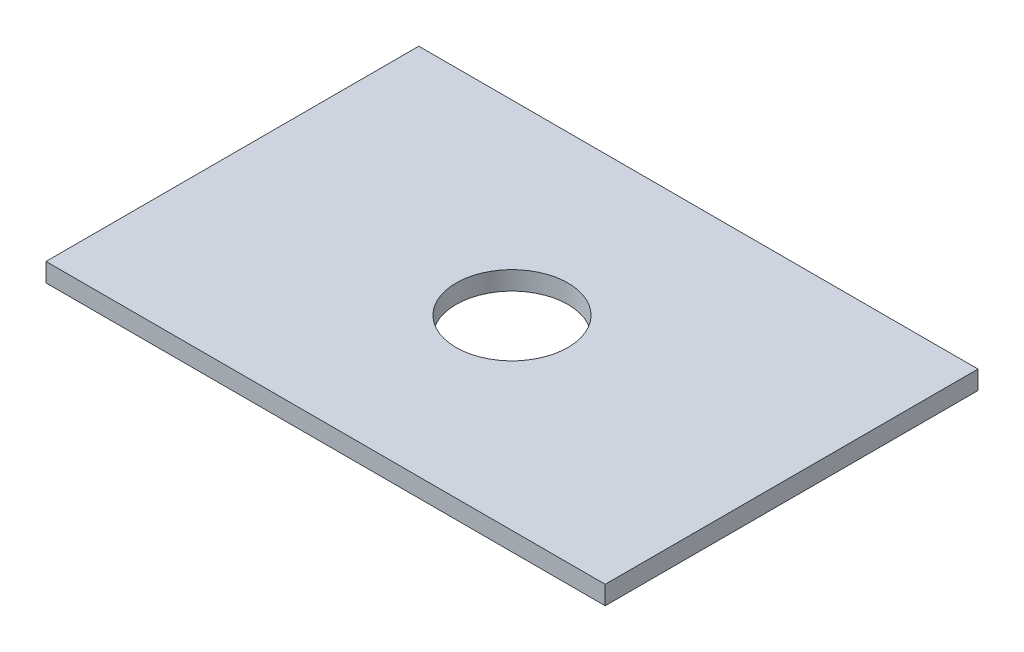
ISO-10303-21;
HEADER;
FILE_DESCRIPTION(('STEP AP214'),'2;1');
FILE_NAME('part.step','',(''),(''),'','','');
FILE_SCHEMA(('AUTOMOTIVE_DESIGN { 1 0 10303 214 1 1 1 1 }'));
ENDSEC;
DATA;
#1=APPLICATION_CONTEXT('core data for automotive mechanical design processes');
#2=APPLICATION_PROTOCOL_DEFINITION('international standard','automotive_design',2000,#1);
#3=PRODUCT_CONTEXT('',#1,'mechanical');
#4=PRODUCT('Part','Part','',(#3));
#5=PRODUCT_RELATED_PRODUCT_CATEGORY('part','',(#4));
#6=PRODUCT_DEFINITION_FORMATION('','',#4);
#7=PRODUCT_DEFINITION_CONTEXT('part definition',#1,'design');
#8=PRODUCT_DEFINITION('design','',#6,#7);
#9=PRODUCT_DEFINITION_SHAPE('','',#8);
#10=(LENGTH_UNIT() NAMED_UNIT(*) SI_UNIT(.MILLI.,.METRE.));
#11=(NAMED_UNIT(*) PLANE_ANGLE_UNIT() SI_UNIT($,.RADIAN.));
#12=(NAMED_UNIT(*) SI_UNIT($,.STERADIAN.) SOLID_ANGLE_UNIT());
#13=UNCERTAINTY_MEASURE_WITH_UNIT(LENGTH_MEASURE(1.E-05),#10,'distance_accuracy_value','');
#14=(GEOMETRIC_REPRESENTATION_CONTEXT(3) GLOBAL_UNCERTAINTY_ASSIGNED_CONTEXT((#13)) GLOBAL_UNIT_ASSIGNED_CONTEXT((#10,
#11,#12)) REPRESENTATION_CONTEXT('',''));
#15=CARTESIAN_POINT('',(0.,0.,0.));
#16=DIRECTION('',(0.,0.,1.));
#17=DIRECTION('',(1.,0.,0.));
#18=AXIS2_PLACEMENT_3D('',#15,#16,#17);
#19=CARTESIAN_POINT('',(150.,10.,100.));
#20=DIRECTION('',(-1.,0.,0.));
#21=DIRECTION('',(0.,0.,1.));
#22=AXIS2_PLACEMENT_3D('',#19,#20,#21);
#23=PLANE('',#22);
#24=DIRECTION('',(0.,0.,-1.));
#25=VECTOR('',#24,1.);
#26=CARTESIAN_POINT('',(150.,0.,100.));
#27=LINE('',#26,#25);
#28=CARTESIAN_POINT('',(150.,0.,100.));
#29=VERTEX_POINT('',#28);
#30=CARTESIAN_POINT('',(150.,0.,-100.));
#31=VERTEX_POINT('',#30);
#32=EDGE_CURVE('E96',#29,#31,#27,.T.);
#33=ORIENTED_EDGE('',*,*,#32,.T.);
#34=DIRECTION('',(0.,-1.,0.));
#35=VECTOR('',#34,1.);
#36=CARTESIAN_POINT('',(150.,10.,-100.));
#37=LINE('',#36,#35);
#38=CARTESIAN_POINT('',(150.,10.,-100.));
#39=VERTEX_POINT('',#38);
#40=EDGE_CURVE('E11',#39,#31,#37,.T.);
#41=ORIENTED_EDGE('',*,*,#40,.F.);
#42=DIRECTION('',(0.,0.,-1.));
#43=VECTOR('',#42,1.);
#44=CARTESIAN_POINT('',(150.,10.,100.));
#45=LINE('',#44,#43);
#46=CARTESIAN_POINT('',(150.,10.,100.));
#47=VERTEX_POINT('',#46);
#48=EDGE_CURVE('E84',#47,#39,#45,.T.);
#49=ORIENTED_EDGE('',*,*,#48,.F.);
#50=DIRECTION('',(0.,-1.,0.));
#51=VECTOR('',#50,1.);
#52=CARTESIAN_POINT('',(150.,10.,100.));
#53=LINE('',#52,#51);
#54=EDGE_CURVE('E92',#47,#29,#53,.T.);
#55=ORIENTED_EDGE('',*,*,#54,.T.);
#56=EDGE_LOOP('',(#33,#41,#49,#55));
#57=FACE_BOUND('',#56,.T.);
#58=ADVANCED_FACE('F33',(#57),#23,.F.);
#59=CARTESIAN_POINT('',(-150.,10.,-100.));
#60=DIRECTION('',(0.,0.,1.));
#61=DIRECTION('',(1.,0.,0.));
#62=AXIS2_PLACEMENT_3D('',#59,#60,#61);
#63=PLANE('',#62);
#64=DIRECTION('',(-1.,0.,0.));
#65=VECTOR('',#64,1.);
#66=CARTESIAN_POINT('',(-150.,0.,-100.));
#67=LINE('',#66,#65);
#68=CARTESIAN_POINT('',(-150.,0.,-100.));
#69=VERTEX_POINT('',#68);
#70=EDGE_CURVE('E88',#31,#69,#67,.T.);
#71=ORIENTED_EDGE('',*,*,#70,.T.);
#72=DIRECTION('',(0.,-1.,0.));
#73=VECTOR('',#72,1.);
#74=CARTESIAN_POINT('',(-150.,10.,-100.));
#75=LINE('',#74,#73);
#76=CARTESIAN_POINT('',(-150.,10.,-100.));
#77=VERTEX_POINT('',#76);
#78=EDGE_CURVE('E41',#77,#69,#75,.T.);
#79=ORIENTED_EDGE('',*,*,#78,.F.);
#80=DIRECTION('',(-1.,0.,0.));
#81=VECTOR('',#80,1.);
#82=CARTESIAN_POINT('',(-150.,10.,-100.));
#83=LINE('',#82,#81);
#84=EDGE_CURVE('E79',#39,#77,#83,.T.);
#85=ORIENTED_EDGE('',*,*,#84,.F.);
#86=ORIENTED_EDGE('',*,*,#40,.T.);
#87=EDGE_LOOP('',(#71,#79,#85,#86));
#88=FACE_BOUND('',#87,.T.);
#89=ADVANCED_FACE('F87',(#88),#63,.F.);
#90=CARTESIAN_POINT('',(-150.,10.,100.));
#91=DIRECTION('',(1.,0.,0.));
#92=DIRECTION('',(0.,0.,-1.));
#93=AXIS2_PLACEMENT_3D('',#90,#91,#92);
#94=PLANE('',#93);
#95=DIRECTION('',(0.,0.,1.));
#96=VECTOR('',#95,1.);
#97=CARTESIAN_POINT('',(-150.,0.,100.));
#98=LINE('',#97,#96);
#99=CARTESIAN_POINT('',(-150.,0.,100.));
#100=VERTEX_POINT('',#99);
#101=EDGE_CURVE('E66',#69,#100,#98,.T.);
#102=ORIENTED_EDGE('',*,*,#101,.T.);
#103=DIRECTION('',(0.,-1.,0.));
#104=VECTOR('',#103,1.);
#105=CARTESIAN_POINT('',(-150.,10.,100.));
#106=LINE('',#105,#104);
#107=CARTESIAN_POINT('',(-150.,10.,100.));
#108=VERTEX_POINT('',#107);
#109=EDGE_CURVE('E89',#108,#100,#106,.T.);
#110=ORIENTED_EDGE('',*,*,#109,.F.);
#111=DIRECTION('',(0.,0.,1.));
#112=VECTOR('',#111,1.);
#113=CARTESIAN_POINT('',(-150.,10.,100.));
#114=LINE('',#113,#112);
#115=EDGE_CURVE('E82',#77,#108,#114,.T.);
#116=ORIENTED_EDGE('',*,*,#115,.F.);
#117=ORIENTED_EDGE('',*,*,#78,.T.);
#118=EDGE_LOOP('',(#102,#110,#116,#117));
#119=FACE_BOUND('',#118,.T.);
#120=ADVANCED_FACE('F90',(#119),#94,.F.);
#121=CARTESIAN_POINT('',(-150.,10.,100.));
#122=DIRECTION('',(0.,0.,-1.));
#123=DIRECTION('',(-1.,0.,0.));
#124=AXIS2_PLACEMENT_3D('',#121,#122,#123);
#125=PLANE('',#124);
#126=DIRECTION('',(1.,0.,0.));
#127=VECTOR('',#126,1.);
#128=CARTESIAN_POINT('',(-150.,0.,100.));
#129=LINE('',#128,#127);
#130=EDGE_CURVE('E72',#100,#29,#129,.T.);
#131=ORIENTED_EDGE('',*,*,#130,.T.);
#132=ORIENTED_EDGE('',*,*,#54,.F.);
#133=DIRECTION('',(1.,0.,0.));
#134=VECTOR('',#133,1.);
#135=CARTESIAN_POINT('',(-150.,10.,100.));
#136=LINE('',#135,#134);
#137=EDGE_CURVE('E49',#108,#47,#136,.T.);
#138=ORIENTED_EDGE('',*,*,#137,.F.);
#139=ORIENTED_EDGE('',*,*,#109,.T.);
#140=EDGE_LOOP('',(#131,#132,#138,#139));
#141=FACE_BOUND('',#140,.T.);
#142=ADVANCED_FACE('F104',(#141),#125,.F.);
#143=CARTESIAN_POINT('',(0.,10.,0.));
#144=DIRECTION('',(0.,-1.,0.));
#145=DIRECTION('',(0.,0.,-1.));
#146=AXIS2_PLACEMENT_3D('',#143,#144,#145);
#147=PLANE('',#146);
#148=CARTESIAN_POINT('',(0.,10.,0.));
#149=DIRECTION('',(0.,1.,0.));
#150=DIRECTION('',(0.,0.,1.));
#151=AXIS2_PLACEMENT_3D('',#148,#149,#150);
#152=CIRCLE('',#151,30.);
#153=CARTESIAN_POINT('',(0.,10.,30.));
#154=VERTEX_POINT('',#153);
#155=EDGE_CURVE('E112',#154,#154,#152,.T.);
#156=ORIENTED_EDGE('',*,*,#155,.F.);
#157=EDGE_LOOP('',(#156));
#158=FACE_BOUND('',#157,.T.);
#159=ORIENTED_EDGE('',*,*,#48,.T.);
#160=ORIENTED_EDGE('',*,*,#84,.T.);
#161=ORIENTED_EDGE('',*,*,#115,.T.);
#162=ORIENTED_EDGE('',*,*,#137,.T.);
#163=EDGE_LOOP('',(#159,#160,#161,#162));
#164=FACE_BOUND('',#163,.T.);
#165=ADVANCED_FACE('F80',(#158,#164),#147,.F.);
#166=CARTESIAN_POINT('',(0.,0.,0.));
#167=DIRECTION('',(0.,-1.,0.));
#168=DIRECTION('',(0.,0.,-1.));
#169=AXIS2_PLACEMENT_3D('',#166,#167,#168);
#170=PLANE('',#169);
#171=CARTESIAN_POINT('',(0.,0.,0.));
#172=DIRECTION('',(0.,-1.,0.));
#173=DIRECTION('',(0.,0.,-1.));
#174=AXIS2_PLACEMENT_3D('',#171,#172,#173);
#175=CIRCLE('',#174,30.);
#176=CARTESIAN_POINT('',(0.,0.,-30.));
#177=VERTEX_POINT('',#176);
#178=EDGE_CURVE('E99',#177,#177,#175,.F.);
#179=ORIENTED_EDGE('',*,*,#178,.T.);
#180=EDGE_LOOP('',(#179));
#181=FACE_BOUND('',#180,.T.);
#182=ORIENTED_EDGE('',*,*,#32,.F.);
#183=ORIENTED_EDGE('',*,*,#130,.F.);
#184=ORIENTED_EDGE('',*,*,#101,.F.);
#185=ORIENTED_EDGE('',*,*,#70,.F.);
#186=EDGE_LOOP('',(#182,#183,#184,#185));
#187=FACE_BOUND('',#186,.T.);
#188=ADVANCED_FACE('F107',(#181,#187),#170,.T.);
#189=CARTESIAN_POINT('',(0.,-84.8528137423857,0.));
#190=DIRECTION('',(0.,1.,0.));
#191=DIRECTION('',(0.,0.,1.));
#192=AXIS2_PLACEMENT_3D('',#189,#190,#191);
#193=CYLINDRICAL_SURFACE('',#192,30.);
#194=ORIENTED_EDGE('',*,*,#155,.T.);
#195=EDGE_LOOP('',(#194));
#196=FACE_BOUND('',#195,.T.);
#197=ORIENTED_EDGE('',*,*,#178,.F.);
#198=EDGE_LOOP('',(#197));
#199=FACE_BOUND('',#198,.T.);
#200=ADVANCED_FACE('F116',(#196,#199),#193,.F.);
#201=CLOSED_SHELL('',(#58,#89,#120,#142,#165,#188,#200));
#202=MANIFOLD_SOLID_BREP('B2',#201);
#203=ADVANCED_BREP_SHAPE_REPRESENTATION('',(#18,#202),#14);
#204=SHAPE_DEFINITION_REPRESENTATION(#9,#203);
ENDSEC;
END-ISO-10303-21;
